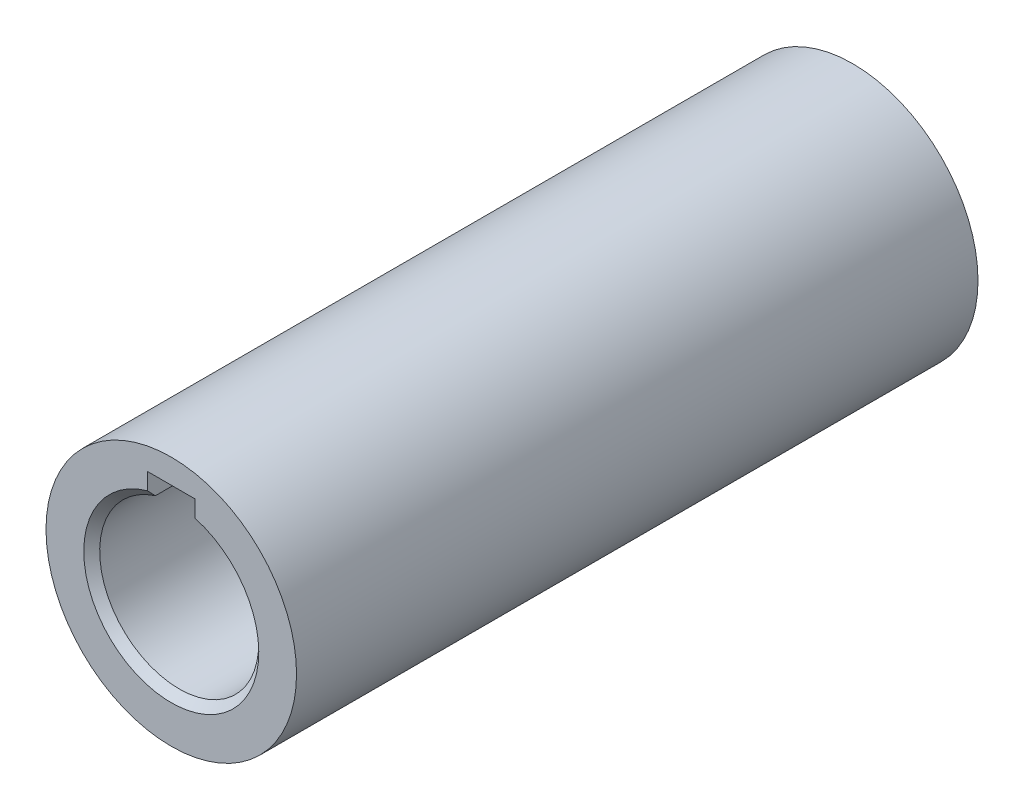
ISO-10303-21;
HEADER;
FILE_DESCRIPTION(('STEP AP214'),'2;1');
FILE_NAME('part.step','',(''),(''),'','','');
FILE_SCHEMA(('AUTOMOTIVE_DESIGN { 1 0 10303 214 1 1 1 1 }'));
ENDSEC;
DATA;
#1=APPLICATION_CONTEXT('core data for automotive mechanical design processes');
#2=APPLICATION_PROTOCOL_DEFINITION('international standard','automotive_design',2000,#1);
#3=PRODUCT_CONTEXT('',#1,'mechanical');
#4=PRODUCT('Part','Part','',(#3));
#5=PRODUCT_RELATED_PRODUCT_CATEGORY('part','',(#4));
#6=PRODUCT_DEFINITION_FORMATION('','',#4);
#7=PRODUCT_DEFINITION_CONTEXT('part definition',#1,'design');
#8=PRODUCT_DEFINITION('design','',#6,#7);
#9=PRODUCT_DEFINITION_SHAPE('','',#8);
#10=(LENGTH_UNIT() NAMED_UNIT(*) SI_UNIT(.MILLI.,.METRE.));
#11=(NAMED_UNIT(*) PLANE_ANGLE_UNIT() SI_UNIT($,.RADIAN.));
#12=(NAMED_UNIT(*) SI_UNIT($,.STERADIAN.) SOLID_ANGLE_UNIT());
#13=UNCERTAINTY_MEASURE_WITH_UNIT(LENGTH_MEASURE(1.E-05),#10,'distance_accuracy_value','');
#14=(GEOMETRIC_REPRESENTATION_CONTEXT(3) GLOBAL_UNCERTAINTY_ASSIGNED_CONTEXT((#13)) GLOBAL_UNIT_ASSIGNED_CONTEXT((#10,
#11,#12)) REPRESENTATION_CONTEXT('',''));
#15=CARTESIAN_POINT('',(0.,0.,0.));
#16=DIRECTION('',(0.,0.,1.));
#17=DIRECTION('',(1.,0.,0.));
#18=AXIS2_PLACEMENT_3D('',#15,#16,#17);
#19=CARTESIAN_POINT('',(0.,0.,34.));
#20=DIRECTION('',(0.,0.,-1.));
#21=DIRECTION('',(-1.,0.,0.));
#22=AXIS2_PLACEMENT_3D('',#19,#20,#21);
#23=CYLINDRICAL_SURFACE('',#22,12.5);
#24=CARTESIAN_POINT('',(0.,0.,34.));
#25=DIRECTION('',(0.,0.,1.));
#26=DIRECTION('',(1.,0.,0.));
#27=AXIS2_PLACEMENT_3D('',#24,#25,#26);
#28=CIRCLE('',#27,12.5);
#29=CARTESIAN_POINT('',(12.5,0.,34.));
#30=VERTEX_POINT('',#29);
#31=EDGE_CURVE('E128',#30,#30,#28,.T.);
#32=ORIENTED_EDGE('',*,*,#31,.F.);
#33=EDGE_LOOP('',(#32));
#34=FACE_BOUND('',#33,.T.);
#35=CARTESIAN_POINT('',(0.,0.,-34.));
#36=DIRECTION('',(0.,0.,1.));
#37=DIRECTION('',(1.,0.,0.));
#38=AXIS2_PLACEMENT_3D('',#35,#36,#37);
#39=CIRCLE('',#38,12.5);
#40=CARTESIAN_POINT('',(12.5,0.,-34.));
#41=VERTEX_POINT('',#40);
#42=EDGE_CURVE('E121',#41,#41,#39,.T.);
#43=ORIENTED_EDGE('',*,*,#42,.T.);
#44=EDGE_LOOP('',(#43));
#45=FACE_BOUND('',#44,.T.);
#46=ADVANCED_FACE('F34',(#34,#45),#23,.T.);
#47=CARTESIAN_POINT('',(0.,0.,34.));
#48=DIRECTION('',(0.,0.,1.));
#49=DIRECTION('',(1.,0.,0.));
#50=AXIS2_PLACEMENT_3D('',#47,#48,#49);
#51=PLANE('',#50);
#52=DIRECTION('',(0.,-1.,0.));
#53=VECTOR('',#52,1.);
#54=CARTESIAN_POINT('',(2.38125,10.0711,34.));
#55=LINE('',#54,#53);
#56=CARTESIAN_POINT('',(2.38125,10.0711,34.));
#57=VERTEX_POINT('',#56);
#58=CARTESIAN_POINT('',(2.38125,8.40026041263007,34.));
#59=VERTEX_POINT('',#58);
#60=EDGE_CURVE('E111',#57,#59,#55,.T.);
#61=ORIENTED_EDGE('',*,*,#60,.T.);
#62=CARTESIAN_POINT('',(0.,0.,34.));
#63=DIRECTION('',(0.,0.,1.));
#64=DIRECTION('',(1.,0.,0.));
#65=AXIS2_PLACEMENT_3D('',#62,#63,#64);
#66=CIRCLE('',#65,8.73125);
#67=CARTESIAN_POINT('',(-2.38125,8.40026041263007,34.));
#68=VERTEX_POINT('',#67);
#69=EDGE_CURVE('E11',#59,#68,#66,.F.);
#70=ORIENTED_EDGE('',*,*,#69,.T.);
#71=DIRECTION('',(0.,1.,0.));
#72=VECTOR('',#71,1.);
#73=CARTESIAN_POINT('',(-2.38125,7.57189241124701,34.));
#74=LINE('',#73,#72);
#75=CARTESIAN_POINT('',(-2.38125,10.0711,34.));
#76=VERTEX_POINT('',#75);
#77=EDGE_CURVE('E113',#68,#76,#74,.T.);
#78=ORIENTED_EDGE('',*,*,#77,.T.);
#79=DIRECTION('',(-1.,0.,0.));
#80=VECTOR('',#79,1.);
#81=CARTESIAN_POINT('',(2.38125,10.0711,34.));
#82=LINE('',#81,#80);
#83=EDGE_CURVE('E105',#57,#76,#82,.T.);
#84=ORIENTED_EDGE('',*,*,#83,.F.);
#85=EDGE_LOOP('',(#61,#70,#78,#84));
#86=FACE_BOUND('',#85,.T.);
#87=ORIENTED_EDGE('',*,*,#31,.T.);
#88=EDGE_LOOP('',(#87));
#89=FACE_BOUND('',#88,.T.);
#90=ADVANCED_FACE('F175',(#86,#89),#51,.T.);
#91=CARTESIAN_POINT('',(0.,0.,-34.));
#92=DIRECTION('',(0.,0.,1.));
#93=DIRECTION('',(1.,0.,0.));
#94=AXIS2_PLACEMENT_3D('',#91,#92,#93);
#95=PLANE('',#94);
#96=DIRECTION('',(0.,1.,0.));
#97=VECTOR('',#96,1.);
#98=CARTESIAN_POINT('',(-2.38125,7.57189241124701,-34.));
#99=LINE('',#98,#97);
#100=CARTESIAN_POINT('',(-2.38125,8.40026041263006,-34.));
#101=VERTEX_POINT('',#100);
#102=CARTESIAN_POINT('',(-2.38125,10.0711,-34.));
#103=VERTEX_POINT('',#102);
#104=EDGE_CURVE('E87',#101,#103,#99,.T.);
#105=ORIENTED_EDGE('',*,*,#104,.F.);
#106=CARTESIAN_POINT('',(0.,0.,-34.));
#107=DIRECTION('',(0.,0.,1.));
#108=DIRECTION('',(1.,0.,0.));
#109=AXIS2_PLACEMENT_3D('',#106,#107,#108);
#110=CIRCLE('',#109,8.73124999999999);
#111=CARTESIAN_POINT('',(2.38125,8.40026041263006,-34.));
#112=VERTEX_POINT('',#111);
#113=EDGE_CURVE('E131',#101,#112,#110,.T.);
#114=ORIENTED_EDGE('',*,*,#113,.T.);
#115=DIRECTION('',(0.,-1.,0.));
#116=VECTOR('',#115,1.);
#117=CARTESIAN_POINT('',(2.38125,10.0711,-34.));
#118=LINE('',#117,#116);
#119=CARTESIAN_POINT('',(2.38125,10.0711,-34.));
#120=VERTEX_POINT('',#119);
#121=EDGE_CURVE('E96',#120,#112,#118,.T.);
#122=ORIENTED_EDGE('',*,*,#121,.F.);
#123=DIRECTION('',(-1.,0.,0.));
#124=VECTOR('',#123,1.);
#125=CARTESIAN_POINT('',(2.38125,10.0711,-34.));
#126=LINE('',#125,#124);
#127=EDGE_CURVE('E97',#120,#103,#126,.T.);
#128=ORIENTED_EDGE('',*,*,#127,.T.);
#129=EDGE_LOOP('',(#105,#114,#122,#128));
#130=FACE_BOUND('',#129,.T.);
#131=ORIENTED_EDGE('',*,*,#42,.F.);
#132=EDGE_LOOP('',(#131));
#133=FACE_BOUND('',#132,.T.);
#134=ADVANCED_FACE('F108',(#130,#133),#95,.F.);
#135=CARTESIAN_POINT('',(2.38125,10.0711,-34.));
#136=DIRECTION('',(0.,1.,0.));
#137=DIRECTION('',(-1.,0.,0.));
#138=AXIS2_PLACEMENT_3D('',#135,#136,#137);
#139=PLANE('',#138);
#140=ORIENTED_EDGE('',*,*,#83,.T.);
#141=DIRECTION('',(0.,0.,1.));
#142=VECTOR('',#141,1.);
#143=CARTESIAN_POINT('',(-2.38125,10.0711,-34.));
#144=LINE('',#143,#142);
#145=EDGE_CURVE('E90',#103,#76,#144,.T.);
#146=ORIENTED_EDGE('',*,*,#145,.F.);
#147=ORIENTED_EDGE('',*,*,#127,.F.);
#148=DIRECTION('',(0.,0.,1.));
#149=VECTOR('',#148,1.);
#150=CARTESIAN_POINT('',(2.38125,10.0711,-34.));
#151=LINE('',#150,#149);
#152=EDGE_CURVE('E119',#120,#57,#151,.T.);
#153=ORIENTED_EDGE('',*,*,#152,.T.);
#154=EDGE_LOOP('',(#140,#146,#147,#153));
#155=FACE_BOUND('',#154,.T.);
#156=ADVANCED_FACE('F102',(#155),#139,.F.);
#157=CARTESIAN_POINT('',(2.38125,10.0711,-34.));
#158=DIRECTION('',(-1.,0.,0.));
#159=DIRECTION('',(0.,-1.,0.));
#160=AXIS2_PLACEMENT_3D('',#157,#158,#159);
#161=PLANE('',#160);
#162=ORIENTED_EDGE('',*,*,#121,.T.);
#163=CARTESIAN_POINT('',(2.38125,8.40026041263006,-34.));
#164=CARTESIAN_POINT('',(2.38125,8.26247956876106,-33.8674156253683));
#165=CARTESIAN_POINT('',(2.38125,8.12455848374661,-33.7349776082513));
#166=CARTESIAN_POINT('',(2.38125,7.84843581664894,-33.4703942748867));
#167=CARTESIAN_POINT('',(2.38125,7.71023423453571,-33.3382489586703));
#168=CARTESIAN_POINT('',(2.38125,7.57189241124701,-33.20625));
#169=B_SPLINE_CURVE_WITH_KNOTS('',3,(#163,#164,#165,#166,#167,#168),.UNSPECIFIED.,.F.,.F.,(4,2,
4),(0.,0.573636197101345,1.14727245560386),.UNSPECIFIED.);
#170=CARTESIAN_POINT('',(2.38125,7.57189241124701,-33.20625));
#171=VERTEX_POINT('',#170);
#172=EDGE_CURVE('E139',#112,#171,#169,.T.);
#173=ORIENTED_EDGE('',*,*,#172,.T.);
#174=DIRECTION('',(0.,0.,1.));
#175=VECTOR('',#174,1.);
#176=CARTESIAN_POINT('',(2.38125,7.57189241124701,-34.));
#177=LINE('',#176,#175);
#178=CARTESIAN_POINT('',(2.38125,7.57189241124701,33.20625));
#179=VERTEX_POINT('',#178);
#180=EDGE_CURVE('E122',#171,#179,#177,.T.);
#181=ORIENTED_EDGE('',*,*,#180,.T.);
#182=CARTESIAN_POINT('',(2.38125,7.57189241124701,33.20625));
#183=CARTESIAN_POINT('',(2.38125,7.71023423453571,33.3382489586703));
#184=CARTESIAN_POINT('',(2.38125,7.84843581664894,33.4703942748867));
#185=CARTESIAN_POINT('',(2.38125,8.12455848374661,33.7349776082513));
#186=CARTESIAN_POINT('',(2.38125,8.26247956876106,33.8674156253683));
#187=CARTESIAN_POINT('',(2.38125,8.40026041263007,34.));
#188=B_SPLINE_CURVE_WITH_KNOTS('',3,(#182,#183,#184,#185,#186,#187),.UNSPECIFIED.,.F.,.F.,(4,2,
4),(0.,0.573636258502526,1.14727245560387),.UNSPECIFIED.);
#189=EDGE_CURVE('E133',#179,#59,#188,.T.);
#190=ORIENTED_EDGE('',*,*,#189,.T.);
#191=ORIENTED_EDGE('',*,*,#60,.F.);
#192=ORIENTED_EDGE('',*,*,#152,.F.);
#193=EDGE_LOOP('',(#162,#173,#181,#190,#191,#192));
#194=FACE_BOUND('',#193,.T.);
#195=ADVANCED_FACE('F144',(#194),#161,.T.);
#196=CARTESIAN_POINT('',(0.,0.,-34.));
#197=DIRECTION('',(0.,0.,1.));
#198=DIRECTION('',(1.,0.,0.));
#199=AXIS2_PLACEMENT_3D('',#196,#197,#198);
#200=CYLINDRICAL_SURFACE('',#199,7.9375);
#201=ORIENTED_EDGE('',*,*,#180,.F.);
#202=CARTESIAN_POINT('',(0.,0.,-33.20625));
#203=DIRECTION('',(0.,0.,1.));
#204=DIRECTION('',(1.,0.,0.));
#205=AXIS2_PLACEMENT_3D('',#202,#203,#204);
#206=CIRCLE('',#205,7.9375);
#207=CARTESIAN_POINT('',(-2.38125,7.57189241124701,-33.20625));
#208=VERTEX_POINT('',#207);
#209=EDGE_CURVE('E247',#171,#208,#206,.F.);
#210=ORIENTED_EDGE('',*,*,#209,.T.);
#211=DIRECTION('',(0.,0.,1.));
#212=VECTOR('',#211,1.);
#213=CARTESIAN_POINT('',(-2.38125,7.57189241124701,-34.));
#214=LINE('',#213,#212);
#215=CARTESIAN_POINT('',(-2.38125,7.57189241124701,33.20625));
#216=VERTEX_POINT('',#215);
#217=EDGE_CURVE('E106',#208,#216,#214,.T.);
#218=ORIENTED_EDGE('',*,*,#217,.T.);
#219=CARTESIAN_POINT('',(0.,0.,33.20625));
#220=DIRECTION('',(0.,0.,1.));
#221=DIRECTION('',(1.,0.,0.));
#222=AXIS2_PLACEMENT_3D('',#219,#220,#221);
#223=CIRCLE('',#222,7.9375);
#224=EDGE_CURVE('E246',#216,#179,#223,.T.);
#225=ORIENTED_EDGE('',*,*,#224,.T.);
#226=EDGE_LOOP('',(#201,#210,#218,#225));
#227=FACE_BOUND('',#226,.T.);
#228=ADVANCED_FACE('F148',(#227),#200,.F.);
#229=CARTESIAN_POINT('',(-2.38125,7.57189241124701,-34.));
#230=DIRECTION('',(1.,0.,0.));
#231=DIRECTION('',(0.,1.,0.));
#232=AXIS2_PLACEMENT_3D('',#229,#230,#231);
#233=PLANE('',#232);
#234=ORIENTED_EDGE('',*,*,#217,.F.);
#235=CARTESIAN_POINT('',(-2.38125,7.57189241124701,-33.20625));
#236=CARTESIAN_POINT('',(-2.38125,7.71023423453571,-33.3382489586703));
#237=CARTESIAN_POINT('',(-2.38125,7.84843581664894,-33.4703942748867));
#238=CARTESIAN_POINT('',(-2.38125,8.1245584837466,-33.7349776082513));
#239=CARTESIAN_POINT('',(-2.38125,8.26247956876105,-33.8674156253683));
#240=CARTESIAN_POINT('',(-2.38125,8.40026041263006,-34.));
#241=B_SPLINE_CURVE_WITH_KNOTS('',3,(#235,#236,#237,#238,#239,#240),.UNSPECIFIED.,.F.,.F.,(4,2,
4),(0.,0.573636258502516,1.14727245560386),.UNSPECIFIED.);
#242=EDGE_CURVE('E43',#208,#101,#241,.T.);
#243=ORIENTED_EDGE('',*,*,#242,.T.);
#244=ORIENTED_EDGE('',*,*,#104,.T.);
#245=ORIENTED_EDGE('',*,*,#145,.T.);
#246=ORIENTED_EDGE('',*,*,#77,.F.);
#247=CARTESIAN_POINT('',(-2.38125,8.40026041263007,34.));
#248=CARTESIAN_POINT('',(-2.38125,8.26247956876106,33.8674156253683));
#249=CARTESIAN_POINT('',(-2.38125,8.12455848374661,33.7349776082513));
#250=CARTESIAN_POINT('',(-2.38125,7.84843581664895,33.4703942748867));
#251=CARTESIAN_POINT('',(-2.38125,7.71023423453571,33.3382489586703));
#252=CARTESIAN_POINT('',(-2.38125,7.57189241124701,33.20625));
#253=B_SPLINE_CURVE_WITH_KNOTS('',3,(#247,#248,#249,#250,#251,#252),.UNSPECIFIED.,.F.,.F.,(4,2,
4),(0.,0.573636197101347,1.14727245560387),.UNSPECIFIED.);
#254=EDGE_CURVE('E55',#68,#216,#253,.T.);
#255=ORIENTED_EDGE('',*,*,#254,.T.);
#256=EDGE_LOOP('',(#234,#243,#244,#245,#246,#255));
#257=FACE_BOUND('',#256,.T.);
#258=ADVANCED_FACE('F89',(#257),#233,.T.);
#259=CARTESIAN_POINT('',(0.,0.,-34.));
#260=DIRECTION('',(0.,0.,-1.));
#261=DIRECTION('',(-1.,0.,0.));
#262=AXIS2_PLACEMENT_3D('',#259,#260,#261);
#263=CONICAL_SURFACE('',#262,8.73124999999999,0.78539816339744);
#264=ORIENTED_EDGE('',*,*,#242,.F.);
#265=ORIENTED_EDGE('',*,*,#209,.F.);
#266=ORIENTED_EDGE('',*,*,#172,.F.);
#267=ORIENTED_EDGE('',*,*,#113,.F.);
#268=EDGE_LOOP('',(#264,#265,#266,#267));
#269=FACE_BOUND('',#268,.T.);
#270=ADVANCED_FACE('F157',(#269),#263,.F.);
#271=CARTESIAN_POINT('',(0.,0.,33.20625));
#272=DIRECTION('',(0.,0.,1.));
#273=DIRECTION('',(1.,0.,0.));
#274=AXIS2_PLACEMENT_3D('',#271,#272,#273);
#275=CONICAL_SURFACE('',#274,7.9375,0.78539816339744);
#276=ORIENTED_EDGE('',*,*,#254,.F.);
#277=ORIENTED_EDGE('',*,*,#69,.F.);
#278=ORIENTED_EDGE('',*,*,#189,.F.);
#279=ORIENTED_EDGE('',*,*,#224,.F.);
#280=EDGE_LOOP('',(#276,#277,#278,#279));
#281=FACE_BOUND('',#280,.T.);
#282=ADVANCED_FACE('F36',(#281),#275,.F.);
#283=CLOSED_SHELL('',(#46,#90,#134,#156,#195,#228,#258,#270,#282));
#284=MANIFOLD_SOLID_BREP('B2',#283);
#285=ADVANCED_BREP_SHAPE_REPRESENTATION('',(#18,#284),#14);
#286=SHAPE_DEFINITION_REPRESENTATION(#9,#285);
ENDSEC;
END-ISO-10303-21;
